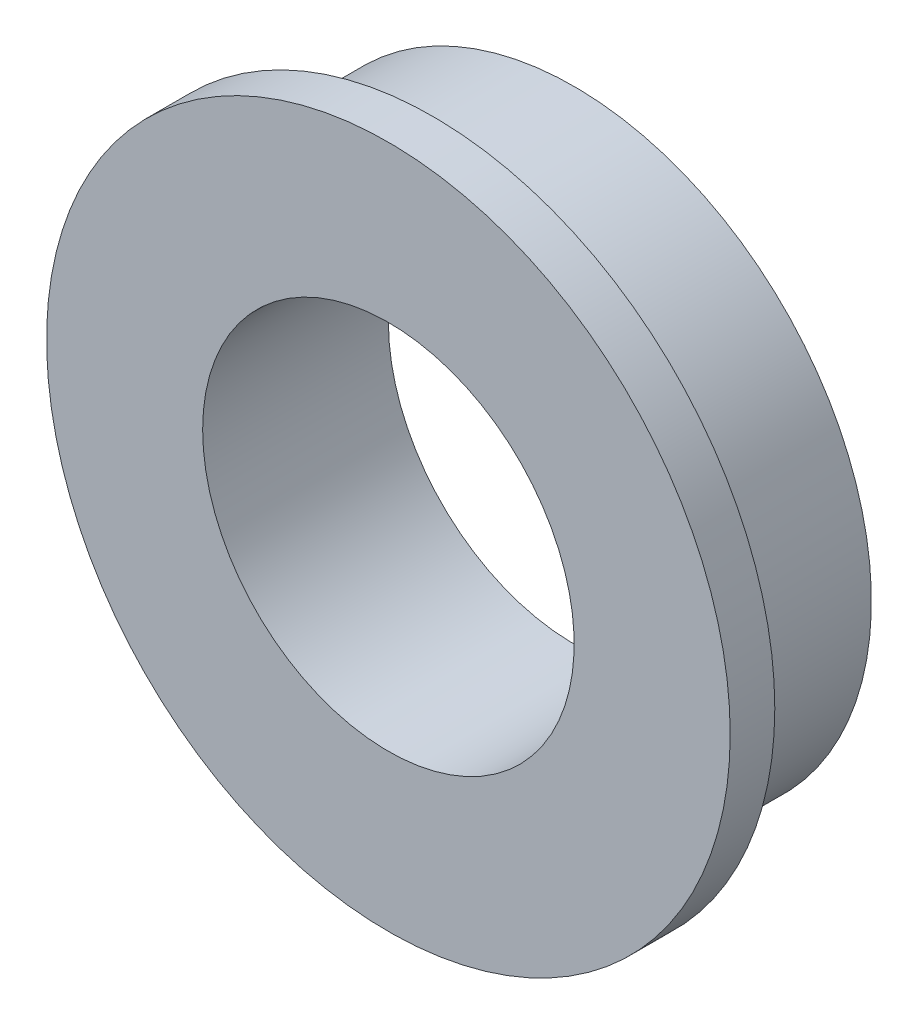
ISO-10303-21;
HEADER;
FILE_DESCRIPTION(('STEP AP214'),'2;1');
FILE_NAME('part.step','',(''),(''),'','','');
FILE_SCHEMA(('AUTOMOTIVE_DESIGN { 1 0 10303 214 1 1 1 1 }'));
ENDSEC;
DATA;
#1=APPLICATION_CONTEXT('core data for automotive mechanical design processes');
#2=APPLICATION_PROTOCOL_DEFINITION('international standard','automotive_design',2000,#1);
#3=PRODUCT_CONTEXT('',#1,'mechanical');
#4=PRODUCT('Part','Part','',(#3));
#5=PRODUCT_RELATED_PRODUCT_CATEGORY('part','',(#4));
#6=PRODUCT_DEFINITION_FORMATION('','',#4);
#7=PRODUCT_DEFINITION_CONTEXT('part definition',#1,'design');
#8=PRODUCT_DEFINITION('design','',#6,#7);
#9=PRODUCT_DEFINITION_SHAPE('','',#8);
#10=(LENGTH_UNIT() NAMED_UNIT(*) SI_UNIT(.MILLI.,.METRE.));
#11=(NAMED_UNIT(*) PLANE_ANGLE_UNIT() SI_UNIT($,.RADIAN.));
#12=(NAMED_UNIT(*) SI_UNIT($,.STERADIAN.) SOLID_ANGLE_UNIT());
#13=UNCERTAINTY_MEASURE_WITH_UNIT(LENGTH_MEASURE(1.E-05),#10,'distance_accuracy_value','');
#14=(GEOMETRIC_REPRESENTATION_CONTEXT(3) GLOBAL_UNCERTAINTY_ASSIGNED_CONTEXT((#13)) GLOBAL_UNIT_ASSIGNED_CONTEXT((#10,
#11,#12)) REPRESENTATION_CONTEXT('',''));
#15=CARTESIAN_POINT('',(0.,0.,0.));
#16=DIRECTION('',(0.,0.,1.));
#17=DIRECTION('',(1.,0.,0.));
#18=AXIS2_PLACEMENT_3D('',#15,#16,#17);
#19=CARTESIAN_POINT('',(0.,0.,0.));
#20=DIRECTION('',(0.,0.,1.));
#21=DIRECTION('',(1.,0.,0.));
#22=AXIS2_PLACEMENT_3D('',#19,#20,#21);
#23=PLANE('',#22);
#24=CARTESIAN_POINT('',(0.,0.,0.));
#25=DIRECTION('',(0.,0.,1.));
#26=DIRECTION('',(1.,0.,0.));
#27=AXIS2_PLACEMENT_3D('',#24,#25,#26);
#28=CIRCLE('',#27,4.);
#29=CARTESIAN_POINT('',(-4.,0.,0.));
#30=VERTEX_POINT('',#29);
#31=EDGE_CURVE('E41',#30,#30,#28,.T.);
#32=ORIENTED_EDGE('',*,*,#31,.F.);
#33=EDGE_LOOP('',(#32));
#34=FACE_BOUND('',#33,.T.);
#35=CARTESIAN_POINT('',(0.,0.,0.));
#36=DIRECTION('',(0.,0.,1.));
#37=DIRECTION('',(1.,0.,0.));
#38=AXIS2_PLACEMENT_3D('',#35,#36,#37);
#39=CIRCLE('',#38,2.5);
#40=CARTESIAN_POINT('',(-2.5,0.,0.));
#41=VERTEX_POINT('',#40);
#42=EDGE_CURVE('E48',#41,#41,#39,.T.);
#43=ORIENTED_EDGE('',*,*,#42,.T.);
#44=EDGE_LOOP('',(#43));
#45=FACE_BOUND('',#44,.T.);
#46=ADVANCED_FACE('F37',(#34,#45),#23,.F.);
#47=CARTESIAN_POINT('',(0.,0.,1.9));
#48=DIRECTION('',(0.,0.,-1.));
#49=DIRECTION('',(-1.,0.,0.));
#50=AXIS2_PLACEMENT_3D('',#47,#48,#49);
#51=CYLINDRICAL_SURFACE('',#50,4.);
#52=CARTESIAN_POINT('',(0.,0.,1.9));
#53=DIRECTION('',(0.,0.,1.));
#54=DIRECTION('',(1.,0.,0.));
#55=AXIS2_PLACEMENT_3D('',#52,#53,#54);
#56=CIRCLE('',#55,4.);
#57=CARTESIAN_POINT('',(-4.,0.,1.9));
#58=VERTEX_POINT('',#57);
#59=EDGE_CURVE('E10',#58,#58,#56,.T.);
#60=CARTESIAN_POINT('',(-4.,0.,1.9));
#61=CARTESIAN_POINT('',(-4.,0.,1.88020833333333));
#62=CARTESIAN_POINT('',(-4.,0.,1.86041666666667));
#63=CARTESIAN_POINT('',(-4.,0.,1.82083333333333));
#64=CARTESIAN_POINT('',(-4.,0.,1.80104166666667));
#65=CARTESIAN_POINT('',(-4.,0.,1.76145833333333));
#66=CARTESIAN_POINT('',(-4.,0.,1.74166666666667));
#67=CARTESIAN_POINT('',(-4.,0.,1.70208333333333));
#68=CARTESIAN_POINT('',(-4.,0.,1.68229166666667));
#69=CARTESIAN_POINT('',(-4.,0.,1.64270833333333));
#70=CARTESIAN_POINT('',(-4.,0.,1.62291666666667));
#71=CARTESIAN_POINT('',(-4.,0.,1.58333333333333));
#72=CARTESIAN_POINT('',(-4.,0.,1.56354166666667));
#73=CARTESIAN_POINT('',(-4.,0.,1.52395833333333));
#74=CARTESIAN_POINT('',(-4.,0.,1.50416666666667));
#75=CARTESIAN_POINT('',(-4.,0.,1.46458333333333));
#76=CARTESIAN_POINT('',(-4.,0.,1.44479166666667));
#77=CARTESIAN_POINT('',(-4.,0.,1.40520833333333));
#78=CARTESIAN_POINT('',(-4.,0.,1.38541666666667));
#79=CARTESIAN_POINT('',(-4.,0.,1.34583333333333));
#80=CARTESIAN_POINT('',(-4.,0.,1.32604166666667));
#81=CARTESIAN_POINT('',(-4.,0.,1.28645833333333));
#82=CARTESIAN_POINT('',(-4.,0.,1.26666666666667));
#83=CARTESIAN_POINT('',(-4.,0.,1.22708333333333));
#84=CARTESIAN_POINT('',(-4.,0.,1.20729166666667));
#85=CARTESIAN_POINT('',(-4.,0.,1.16770833333333));
#86=CARTESIAN_POINT('',(-4.,0.,1.14791666666667));
#87=CARTESIAN_POINT('',(-4.,0.,1.10833333333333));
#88=CARTESIAN_POINT('',(-4.,0.,1.08854166666667));
#89=CARTESIAN_POINT('',(-4.,0.,1.04895833333333));
#90=CARTESIAN_POINT('',(-4.,0.,1.02916666666667));
#91=CARTESIAN_POINT('',(-4.,0.,0.989583333333333));
#92=CARTESIAN_POINT('',(-4.,0.,0.969791666666667));
#93=CARTESIAN_POINT('',(-4.,0.,0.930208333333333));
#94=CARTESIAN_POINT('',(-4.,0.,0.910416666666667));
#95=CARTESIAN_POINT('',(-4.,0.,0.870833333333333));
#96=CARTESIAN_POINT('',(-4.,0.,0.851041666666667));
#97=CARTESIAN_POINT('',(-4.,0.,0.811458333333333));
#98=CARTESIAN_POINT('',(-4.,0.,0.791666666666667));
#99=CARTESIAN_POINT('',(-4.,0.,0.752083333333333));
#100=CARTESIAN_POINT('',(-4.,0.,0.732291666666667));
#101=CARTESIAN_POINT('',(-4.,0.,0.692708333333333));
#102=CARTESIAN_POINT('',(-4.,0.,0.672916666666667));
#103=CARTESIAN_POINT('',(-4.,0.,0.633333333333333));
#104=CARTESIAN_POINT('',(-4.,0.,0.613541666666667));
#105=CARTESIAN_POINT('',(-4.,0.,0.573958333333333));
#106=CARTESIAN_POINT('',(-4.,0.,0.554166666666667));
#107=CARTESIAN_POINT('',(-4.,0.,0.514583333333333));
#108=CARTESIAN_POINT('',(-4.,0.,0.494791666666667));
#109=CARTESIAN_POINT('',(-4.,0.,0.455208333333333));
#110=CARTESIAN_POINT('',(-4.,0.,0.435416666666667));
#111=CARTESIAN_POINT('',(-4.,0.,0.395833333333333));
#112=CARTESIAN_POINT('',(-4.,0.,0.376041666666667));
#113=CARTESIAN_POINT('',(-4.,0.,0.336458333333333));
#114=CARTESIAN_POINT('',(-4.,0.,0.316666666666667));
#115=CARTESIAN_POINT('',(-4.,0.,0.277083333333333));
#116=CARTESIAN_POINT('',(-4.,0.,0.257291666666667));
#117=CARTESIAN_POINT('',(-4.,0.,0.217708333333333));
#118=CARTESIAN_POINT('',(-4.,0.,0.197916666666667));
#119=CARTESIAN_POINT('',(-4.,0.,0.158333333333333));
#120=CARTESIAN_POINT('',(-4.,0.,0.138541666666667));
#121=CARTESIAN_POINT('',(-4.,0.,0.0989583333333333));
#122=CARTESIAN_POINT('',(-4.,0.,0.0791666666666666));
#123=CARTESIAN_POINT('',(-4.,0.,0.0395833333333333));
#124=CARTESIAN_POINT('',(-4.,0.,0.0197916666666666));
#125=CARTESIAN_POINT('',(-4.,0.,0.));
#126=B_SPLINE_CURVE_WITH_KNOTS('',3,(#60,#61,#62,#63,#64,#65,#66,#67,#68,#69,#70,#71,#72,#73,
#74,#75,#76,#77,#78,#79,#80,#81,#82,#83,#84,#85,#86,#87,#88,#89,#90,#91,#92,#93,#94,#95,#96,#97,
#98,#99,#100,#101,#102,#103,#104,#105,#106,#107,#108,#109,#110,#111,#112,#113,#114,#115,#116,
#117,#118,#119,#120,#121,#122,#123,#124,#125),.UNSPECIFIED.,.F.,.F.,(4,2,2,2,2,2,2,2,2,2,2,2,2,
2,2,2,2,2,2,2,2,2,2,2,2,2,2,2,2,2,2,2,4),(0.,0.059375,0.11875,0.178125,0.2375,0.296875,0.35625,
0.415625,0.475,0.534375,0.59375,0.653125,0.7125,0.771875,0.83125,0.890625,0.95,1.009375,1.06875,
1.128125,1.1875,1.246875,1.30625,1.365625,1.425,1.484375,1.54375,1.603125,1.6625,1.721875,
1.78125,1.840625,1.9),.UNSPECIFIED.);
#127=EDGE_CURVE('BSEAM39',#58,#30,#126,.T.);
#128=ORIENTED_EDGE('',*,*,#59,.F.);
#129=ORIENTED_EDGE('',*,*,#31,.T.);
#130=ORIENTED_EDGE('',*,*,#127,.T.);
#131=ORIENTED_EDGE('',*,*,#127,.F.);
#132=EDGE_LOOP('',(#128,#130,#129,#131));
#133=FACE_BOUND('',#132,.T.);
#134=ADVANCED_FACE('F39',(#133),#51,.T.);
#135=CARTESIAN_POINT('',(0.,0.,1.9));
#136=DIRECTION('',(0.,0.,-1.));
#137=DIRECTION('',(-1.,0.,0.));
#138=AXIS2_PLACEMENT_3D('',#135,#136,#137);
#139=CYLINDRICAL_SURFACE('',#138,2.5);
#140=CARTESIAN_POINT('',(0.,0.,2.5));
#141=DIRECTION('',(0.,0.,1.));
#142=DIRECTION('',(1.,0.,0.));
#143=AXIS2_PLACEMENT_3D('',#140,#141,#142);
#144=CIRCLE('',#143,2.5);
#145=CARTESIAN_POINT('',(-2.5,0.,2.5));
#146=VERTEX_POINT('',#145);
#147=EDGE_CURVE('E56',#146,#146,#144,.T.);
#148=CARTESIAN_POINT('',(-2.5,0.,0.));
#149=CARTESIAN_POINT('',(-2.5,0.,0.0260416666666667));
#150=CARTESIAN_POINT('',(-2.5,0.,0.0520833333333334));
#151=CARTESIAN_POINT('',(-2.5,0.,0.104166666666667));
#152=CARTESIAN_POINT('',(-2.5,0.,0.130208333333333));
#153=CARTESIAN_POINT('',(-2.5,0.,0.182291666666667));
#154=CARTESIAN_POINT('',(-2.5,0.,0.208333333333333));
#155=CARTESIAN_POINT('',(-2.5,0.,0.260416666666667));
#156=CARTESIAN_POINT('',(-2.5,0.,0.286458333333333));
#157=CARTESIAN_POINT('',(-2.5,0.,0.338541666666667));
#158=CARTESIAN_POINT('',(-2.5,0.,0.364583333333333));
#159=CARTESIAN_POINT('',(-2.5,0.,0.416666666666667));
#160=CARTESIAN_POINT('',(-2.5,0.,0.442708333333333));
#161=CARTESIAN_POINT('',(-2.5,0.,0.494791666666667));
#162=CARTESIAN_POINT('',(-2.5,0.,0.520833333333333));
#163=CARTESIAN_POINT('',(-2.5,0.,0.572916666666667));
#164=CARTESIAN_POINT('',(-2.5,0.,0.598958333333333));
#165=CARTESIAN_POINT('',(-2.5,0.,0.651041666666667));
#166=CARTESIAN_POINT('',(-2.5,0.,0.677083333333333));
#167=CARTESIAN_POINT('',(-2.5,0.,0.729166666666667));
#168=CARTESIAN_POINT('',(-2.5,0.,0.755208333333333));
#169=CARTESIAN_POINT('',(-2.5,0.,0.807291666666667));
#170=CARTESIAN_POINT('',(-2.5,0.,0.833333333333333));
#171=CARTESIAN_POINT('',(-2.5,0.,0.885416666666667));
#172=CARTESIAN_POINT('',(-2.5,0.,0.911458333333333));
#173=CARTESIAN_POINT('',(-2.5,0.,0.963541666666667));
#174=CARTESIAN_POINT('',(-2.5,0.,0.989583333333333));
#175=CARTESIAN_POINT('',(-2.5,0.,1.04166666666667));
#176=CARTESIAN_POINT('',(-2.5,0.,1.06770833333333));
#177=CARTESIAN_POINT('',(-2.5,0.,1.11979166666667));
#178=CARTESIAN_POINT('',(-2.5,0.,1.14583333333333));
#179=CARTESIAN_POINT('',(-2.5,0.,1.19791666666667));
#180=CARTESIAN_POINT('',(-2.5,0.,1.22395833333333));
#181=CARTESIAN_POINT('',(-2.5,0.,1.27604166666667));
#182=CARTESIAN_POINT('',(-2.5,0.,1.30208333333333));
#183=CARTESIAN_POINT('',(-2.5,0.,1.35416666666667));
#184=CARTESIAN_POINT('',(-2.5,0.,1.38020833333333));
#185=CARTESIAN_POINT('',(-2.5,0.,1.43229166666667));
#186=CARTESIAN_POINT('',(-2.5,0.,1.45833333333333));
#187=CARTESIAN_POINT('',(-2.5,0.,1.51041666666667));
#188=CARTESIAN_POINT('',(-2.5,0.,1.53645833333333));
#189=CARTESIAN_POINT('',(-2.5,0.,1.58854166666667));
#190=CARTESIAN_POINT('',(-2.5,0.,1.61458333333333));
#191=CARTESIAN_POINT('',(-2.5,0.,1.66666666666667));
#192=CARTESIAN_POINT('',(-2.5,0.,1.69270833333333));
#193=CARTESIAN_POINT('',(-2.5,0.,1.74479166666667));
#194=CARTESIAN_POINT('',(-2.5,0.,1.77083333333333));
#195=CARTESIAN_POINT('',(-2.5,0.,1.82291666666667));
#196=CARTESIAN_POINT('',(-2.5,0.,1.84895833333333));
#197=CARTESIAN_POINT('',(-2.5,0.,1.90104166666667));
#198=CARTESIAN_POINT('',(-2.5,0.,1.92708333333333));
#199=CARTESIAN_POINT('',(-2.5,0.,1.97916666666667));
#200=CARTESIAN_POINT('',(-2.5,0.,2.00520833333333));
#201=CARTESIAN_POINT('',(-2.5,0.,2.05729166666667));
#202=CARTESIAN_POINT('',(-2.5,0.,2.08333333333333));
#203=CARTESIAN_POINT('',(-2.5,0.,2.13541666666667));
#204=CARTESIAN_POINT('',(-2.5,0.,2.16145833333333));
#205=CARTESIAN_POINT('',(-2.5,0.,2.21354166666667));
#206=CARTESIAN_POINT('',(-2.5,0.,2.23958333333333));
#207=CARTESIAN_POINT('',(-2.5,0.,2.29166666666667));
#208=CARTESIAN_POINT('',(-2.5,0.,2.31770833333333));
#209=CARTESIAN_POINT('',(-2.5,0.,2.36979166666667));
#210=CARTESIAN_POINT('',(-2.5,0.,2.39583333333333));
#211=CARTESIAN_POINT('',(-2.5,0.,2.44791666666667));
#212=CARTESIAN_POINT('',(-2.5,0.,2.47395833333333));
#213=CARTESIAN_POINT('',(-2.5,0.,2.5));
#214=B_SPLINE_CURVE_WITH_KNOTS('',3,(#148,#149,#150,#151,#152,#153,#154,#155,#156,#157,#158,
#159,#160,#161,#162,#163,#164,#165,#166,#167,#168,#169,#170,#171,#172,#173,#174,#175,#176,#177,
#178,#179,#180,#181,#182,#183,#184,#185,#186,#187,#188,#189,#190,#191,#192,#193,#194,#195,#196,
#197,#198,#199,#200,#201,#202,#203,#204,#205,#206,#207,#208,#209,#210,#211,#212,#213),
.UNSPECIFIED.,.F.,.F.,(4,2,2,2,2,2,2,2,2,2,2,2,2,2,2,2,2,2,2,2,2,2,2,2,2,2,2,2,2,2,2,2,4),(0.,
0.0781250000000001,0.15625,0.234375,0.3125,0.390625,0.46875,0.546875,0.625,0.703125,0.78125,
0.859375,0.9375,1.015625,1.09375,1.171875,1.25,1.328125,1.40625,1.484375,1.5625,1.640625,
1.71875,1.796875,1.875,1.953125,2.03125,2.109375,2.1875,2.265625,2.34375,2.421875,2.5),.UNSPECIFIED.);
#215=EDGE_CURVE('BSEAM62',#41,#146,#214,.T.);
#216=ORIENTED_EDGE('',*,*,#42,.F.);
#217=ORIENTED_EDGE('',*,*,#147,.T.);
#218=ORIENTED_EDGE('',*,*,#215,.T.);
#219=ORIENTED_EDGE('',*,*,#215,.F.);
#220=EDGE_LOOP('',(#216,#218,#217,#219));
#221=FACE_BOUND('',#220,.T.);
#222=ADVANCED_FACE('F62',(#221),#139,.F.);
#223=CARTESIAN_POINT('',(0.,0.,2.5));
#224=DIRECTION('',(0.,0.,1.));
#225=DIRECTION('',(1.,0.,0.));
#226=AXIS2_PLACEMENT_3D('',#223,#224,#225);
#227=PLANE('',#226);
#228=CARTESIAN_POINT('',(0.,0.,2.5));
#229=DIRECTION('',(0.,0.,1.));
#230=DIRECTION('',(1.,0.,0.));
#231=AXIS2_PLACEMENT_3D('',#228,#229,#230);
#232=CIRCLE('',#231,4.6);
#233=CARTESIAN_POINT('',(4.6,0.,2.5));
#234=VERTEX_POINT('',#233);
#235=EDGE_CURVE('E52',#234,#234,#232,.T.);
#236=ORIENTED_EDGE('',*,*,#235,.T.);
#237=EDGE_LOOP('',(#236));
#238=FACE_BOUND('',#237,.T.);
#239=ORIENTED_EDGE('',*,*,#147,.F.);
#240=EDGE_LOOP('',(#239));
#241=FACE_BOUND('',#240,.T.);
#242=ADVANCED_FACE('F64',(#238,#241),#227,.T.);
#243=CARTESIAN_POINT('',(0.,0.,1.9));
#244=DIRECTION('',(0.,0.,1.));
#245=DIRECTION('',(1.,0.,0.));
#246=AXIS2_PLACEMENT_3D('',#243,#244,#245);
#247=PLANE('',#246);
#248=ORIENTED_EDGE('',*,*,#59,.T.);
#249=EDGE_LOOP('',(#248));
#250=FACE_BOUND('',#249,.T.);
#251=CARTESIAN_POINT('',(0.,0.,1.9));
#252=DIRECTION('',(0.,0.,1.));
#253=DIRECTION('',(1.,0.,0.));
#254=AXIS2_PLACEMENT_3D('',#251,#252,#253);
#255=CIRCLE('',#254,4.6);
#256=CARTESIAN_POINT('',(4.6,0.,1.9));
#257=VERTEX_POINT('',#256);
#258=EDGE_CURVE('E53',#257,#257,#255,.T.);
#259=ORIENTED_EDGE('',*,*,#258,.F.);
#260=EDGE_LOOP('',(#259));
#261=FACE_BOUND('',#260,.T.);
#262=ADVANCED_FACE('F66',(#250,#261),#247,.F.);
#263=CARTESIAN_POINT('',(0.,0.,2.5));
#264=DIRECTION('',(0.,0.,-1.));
#265=DIRECTION('',(-1.,0.,0.));
#266=AXIS2_PLACEMENT_3D('',#263,#264,#265);
#267=CYLINDRICAL_SURFACE('',#266,4.6);
#268=ORIENTED_EDGE('',*,*,#235,.F.);
#269=EDGE_LOOP('',(#268));
#270=FACE_BOUND('',#269,.T.);
#271=ORIENTED_EDGE('',*,*,#258,.T.);
#272=EDGE_LOOP('',(#271));
#273=FACE_BOUND('',#272,.T.);
#274=ADVANCED_FACE('F73',(#270,#273),#267,.T.);
#275=CLOSED_SHELL('',(#46,#134,#222,#242,#262,#274));
#276=MANIFOLD_SOLID_BREP('B2',#275);
#277=ADVANCED_BREP_SHAPE_REPRESENTATION('',(#18,#276),#14);
#278=SHAPE_DEFINITION_REPRESENTATION(#9,#277);
ENDSEC;
END-ISO-10303-21;
